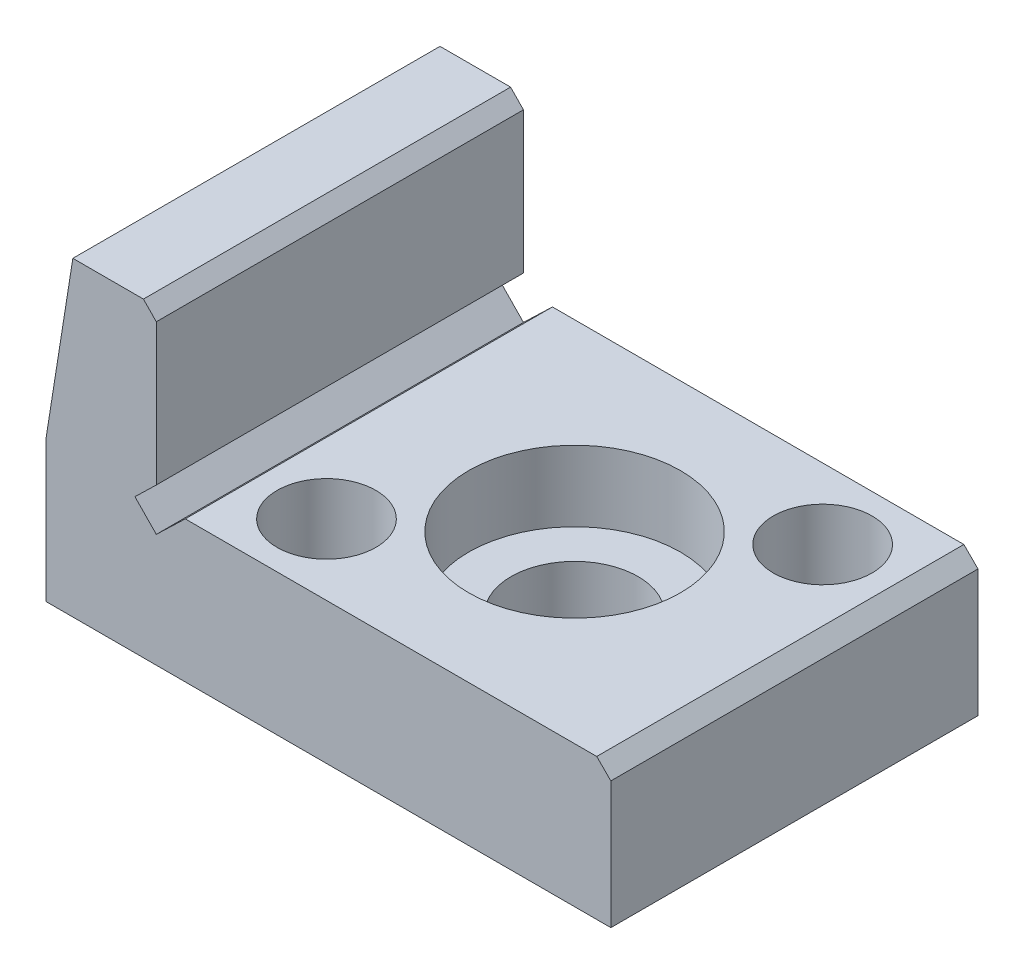
ISO-10303-21;
HEADER;
FILE_DESCRIPTION(('STEP AP214'),'2;1');
FILE_NAME('part.step','',(''),(''),'','','');
FILE_SCHEMA(('AUTOMOTIVE_DESIGN { 1 0 10303 214 1 1 1 1 }'));
ENDSEC;
DATA;
#1=APPLICATION_CONTEXT('core data for automotive mechanical design processes');
#2=APPLICATION_PROTOCOL_DEFINITION('international standard','automotive_design',2000,#1);
#3=PRODUCT_CONTEXT('',#1,'mechanical');
#4=PRODUCT('Part','Part','',(#3));
#5=PRODUCT_RELATED_PRODUCT_CATEGORY('part','',(#4));
#6=PRODUCT_DEFINITION_FORMATION('','',#4);
#7=PRODUCT_DEFINITION_CONTEXT('part definition',#1,'design');
#8=PRODUCT_DEFINITION('design','',#6,#7);
#9=PRODUCT_DEFINITION_SHAPE('','',#8);
#10=(LENGTH_UNIT() NAMED_UNIT(*) SI_UNIT(.MILLI.,.METRE.));
#11=(NAMED_UNIT(*) PLANE_ANGLE_UNIT() SI_UNIT($,.RADIAN.));
#12=(NAMED_UNIT(*) SI_UNIT($,.STERADIAN.) SOLID_ANGLE_UNIT());
#13=UNCERTAINTY_MEASURE_WITH_UNIT(LENGTH_MEASURE(1.E-05),#10,'distance_accuracy_value','');
#14=(GEOMETRIC_REPRESENTATION_CONTEXT(3) GLOBAL_UNCERTAINTY_ASSIGNED_CONTEXT((#13)) GLOBAL_UNIT_ASSIGNED_CONTEXT((#10,
#11,#12)) REPRESENTATION_CONTEXT('',''));
#15=CARTESIAN_POINT('',(0.,0.,0.));
#16=DIRECTION('',(0.,0.,1.));
#17=DIRECTION('',(1.,0.,0.));
#18=AXIS2_PLACEMENT_3D('',#15,#16,#17);
#19=CARTESIAN_POINT('',(24.4314366080419,-16.,13.));
#20=DIRECTION('',(0.,1.,0.));
#21=DIRECTION('',(0.,0.,1.));
#22=AXIS2_PLACEMENT_3D('',#19,#20,#21);
#23=CYLINDRICAL_SURFACE('',#22,4.5);
#24=CARTESIAN_POINT('',(24.4314366080419,0.,13.));
#25=DIRECTION('',(0.,1.,0.));
#26=DIRECTION('',(0.,0.,1.));
#27=AXIS2_PLACEMENT_3D('',#24,#25,#26);
#28=CIRCLE('',#27,4.5);
#29=CARTESIAN_POINT('',(24.4314366080419,0.,17.5));
#30=VERTEX_POINT('',#29);
#31=EDGE_CURVE('E418',#30,#30,#28,.T.);
#32=CARTESIAN_POINT('',(24.4314366080419,5.,13.));
#33=DIRECTION('',(0.,1.,0.));
#34=DIRECTION('',(0.,0.,1.));
#35=AXIS2_PLACEMENT_3D('',#32,#33,#34);
#36=CIRCLE('',#35,4.5);
#37=CARTESIAN_POINT('',(24.4314366080419,5.,17.5));
#38=VERTEX_POINT('',#37);
#39=EDGE_CURVE('E438',#38,#38,#36,.T.);
#40=CARTESIAN_POINT('',(24.4314366080419,0.,17.5));
#41=CARTESIAN_POINT('',(24.4314366080419,0.0520833333333264,17.5));
#42=CARTESIAN_POINT('',(24.4314366080419,0.10416666666666,17.5));
#43=CARTESIAN_POINT('',(24.4314366080419,0.208333333333327,17.5));
#44=CARTESIAN_POINT('',(24.4314366080419,0.26041666666666,17.5));
#45=CARTESIAN_POINT('',(24.4314366080419,0.364583333333327,17.5));
#46=CARTESIAN_POINT('',(24.4314366080419,0.41666666666666,17.5));
#47=CARTESIAN_POINT('',(24.4314366080419,0.520833333333327,17.5));
#48=CARTESIAN_POINT('',(24.4314366080419,0.57291666666666,17.5));
#49=CARTESIAN_POINT('',(24.4314366080419,0.677083333333327,17.5));
#50=CARTESIAN_POINT('',(24.4314366080419,0.72916666666666,17.5));
#51=CARTESIAN_POINT('',(24.4314366080419,0.833333333333327,17.5));
#52=CARTESIAN_POINT('',(24.4314366080419,0.885416666666661,17.5));
#53=CARTESIAN_POINT('',(24.4314366080419,0.989583333333327,17.5));
#54=CARTESIAN_POINT('',(24.4314366080419,1.04166666666666,17.5));
#55=CARTESIAN_POINT('',(24.4314366080419,1.14583333333333,17.5));
#56=CARTESIAN_POINT('',(24.4314366080419,1.19791666666666,17.5));
#57=CARTESIAN_POINT('',(24.4314366080419,1.30208333333333,17.5));
#58=CARTESIAN_POINT('',(24.4314366080419,1.35416666666666,17.5));
#59=CARTESIAN_POINT('',(24.4314366080419,1.45833333333333,17.5));
#60=CARTESIAN_POINT('',(24.4314366080419,1.51041666666666,17.5));
#61=CARTESIAN_POINT('',(24.4314366080419,1.61458333333333,17.5));
#62=CARTESIAN_POINT('',(24.4314366080419,1.66666666666666,17.5));
#63=CARTESIAN_POINT('',(24.4314366080419,1.77083333333333,17.5));
#64=CARTESIAN_POINT('',(24.4314366080419,1.82291666666666,17.5));
#65=CARTESIAN_POINT('',(24.4314366080419,1.92708333333333,17.5));
#66=CARTESIAN_POINT('',(24.4314366080419,1.97916666666667,17.5));
#67=CARTESIAN_POINT('',(24.4314366080419,2.08333333333333,17.5));
#68=CARTESIAN_POINT('',(24.4314366080419,2.13541666666667,17.5));
#69=CARTESIAN_POINT('',(24.4314366080419,2.23958333333333,17.5));
#70=CARTESIAN_POINT('',(24.4314366080419,2.29166666666667,17.5));
#71=CARTESIAN_POINT('',(24.4314366080419,2.39583333333333,17.5));
#72=CARTESIAN_POINT('',(24.4314366080419,2.44791666666667,17.5));
#73=CARTESIAN_POINT('',(24.4314366080419,2.55208333333333,17.5));
#74=CARTESIAN_POINT('',(24.4314366080419,2.60416666666667,17.5));
#75=CARTESIAN_POINT('',(24.4314366080419,2.70833333333333,17.5));
#76=CARTESIAN_POINT('',(24.4314366080419,2.76041666666667,17.5));
#77=CARTESIAN_POINT('',(24.4314366080419,2.86458333333333,17.5));
#78=CARTESIAN_POINT('',(24.4314366080419,2.91666666666667,17.5));
#79=CARTESIAN_POINT('',(24.4314366080419,3.02083333333333,17.5));
#80=CARTESIAN_POINT('',(24.4314366080419,3.07291666666667,17.5));
#81=CARTESIAN_POINT('',(24.4314366080419,3.17708333333333,17.5));
#82=CARTESIAN_POINT('',(24.4314366080419,3.22916666666667,17.5));
#83=CARTESIAN_POINT('',(24.4314366080419,3.33333333333333,17.5));
#84=CARTESIAN_POINT('',(24.4314366080419,3.38541666666667,17.5));
#85=CARTESIAN_POINT('',(24.4314366080419,3.48958333333333,17.5));
#86=CARTESIAN_POINT('',(24.4314366080419,3.54166666666667,17.5));
#87=CARTESIAN_POINT('',(24.4314366080419,3.64583333333333,17.5));
#88=CARTESIAN_POINT('',(24.4314366080419,3.69791666666667,17.5));
#89=CARTESIAN_POINT('',(24.4314366080419,3.80208333333334,17.5));
#90=CARTESIAN_POINT('',(24.4314366080419,3.85416666666667,17.5));
#91=CARTESIAN_POINT('',(24.4314366080419,3.95833333333333,17.5));
#92=CARTESIAN_POINT('',(24.4314366080419,4.01041666666667,17.5));
#93=CARTESIAN_POINT('',(24.4314366080419,4.11458333333334,17.5));
#94=CARTESIAN_POINT('',(24.4314366080419,4.16666666666667,17.5));
#95=CARTESIAN_POINT('',(24.4314366080419,4.27083333333334,17.5));
#96=CARTESIAN_POINT('',(24.4314366080419,4.32291666666667,17.5));
#97=CARTESIAN_POINT('',(24.4314366080419,4.42708333333334,17.5));
#98=CARTESIAN_POINT('',(24.4314366080419,4.47916666666667,17.5));
#99=CARTESIAN_POINT('',(24.4314366080419,4.58333333333334,17.5));
#100=CARTESIAN_POINT('',(24.4314366080419,4.63541666666667,17.5));
#101=CARTESIAN_POINT('',(24.4314366080419,4.73958333333334,17.5));
#102=CARTESIAN_POINT('',(24.4314366080419,4.79166666666667,17.5));
#103=CARTESIAN_POINT('',(24.4314366080419,4.89583333333334,17.5));
#104=CARTESIAN_POINT('',(24.4314366080419,4.94791666666667,17.5));
#105=CARTESIAN_POINT('',(24.4314366080419,5.,17.5));
#106=B_SPLINE_CURVE_WITH_KNOTS('',3,(#40,#41,#42,#43,#44,#45,#46,#47,#48,#49,#50,#51,#52,#53,
#54,#55,#56,#57,#58,#59,#60,#61,#62,#63,#64,#65,#66,#67,#68,#69,#70,#71,#72,#73,#74,#75,#76,#77,
#78,#79,#80,#81,#82,#83,#84,#85,#86,#87,#88,#89,#90,#91,#92,#93,#94,#95,#96,#97,#98,#99,#100,
#101,#102,#103,#104,#105),.UNSPECIFIED.,.F.,.F.,(4,2,2,2,2,2,2,2,2,2,2,2,2,2,2,2,2,2,2,2,2,2,2,
2,2,2,2,2,2,2,2,2,4),(0.,0.15625,0.3125,0.46875,0.625000000000001,0.781250000000001,
0.937500000000001,1.09375,1.25,1.40625,1.5625,1.71875,1.87500000000001,2.03125000000001,
2.18750000000001,2.34375000000001,2.50000000000001,2.65625000000001,2.81250000000001,
2.96875000000001,3.12500000000001,3.28125000000001,3.43750000000001,3.59375000000001,
3.75000000000001,3.90625000000001,4.06250000000001,4.21875000000001,4.37500000000001,
4.53125000000001,4.68750000000001,4.84375000000001,5.00000000000001),.UNSPECIFIED.);
#107=EDGE_CURVE('BSEAM32',#30,#38,#106,.T.);
#108=ORIENTED_EDGE('',*,*,#31,.F.);
#109=ORIENTED_EDGE('',*,*,#39,.T.);
#110=ORIENTED_EDGE('',*,*,#107,.T.);
#111=ORIENTED_EDGE('',*,*,#107,.F.);
#112=EDGE_LOOP('',(#108,#110,#109,#111));
#113=FACE_BOUND('',#112,.T.);
#114=ADVANCED_FACE('F32',(#113),#23,.F.);
#115=CARTESIAN_POINT('',(0.,10.,26.));
#116=DIRECTION('',(1.,0.,0.));
#117=DIRECTION('',(0.,1.,0.));
#118=AXIS2_PLACEMENT_3D('',#115,#116,#117);
#119=PLANE('',#118);
#120=DIRECTION('',(0.,-1.,0.));
#121=VECTOR('',#120,1.);
#122=CARTESIAN_POINT('',(0.,10.,0.));
#123=LINE('',#122,#121);
#124=CARTESIAN_POINT('',(0.,10.,0.));
#125=VERTEX_POINT('',#124);
#126=CARTESIAN_POINT('',(0.,0.,0.));
#127=VERTEX_POINT('',#126);
#128=EDGE_CURVE('E153',#125,#127,#123,.T.);
#129=ORIENTED_EDGE('',*,*,#128,.T.);
#130=DIRECTION('',(0.,0.,-1.));
#131=VECTOR('',#130,1.);
#132=CARTESIAN_POINT('',(0.,0.,26.));
#133=LINE('',#132,#131);
#134=CARTESIAN_POINT('',(0.,0.,26.));
#135=VERTEX_POINT('',#134);
#136=EDGE_CURVE('E11',#135,#127,#133,.T.);
#137=ORIENTED_EDGE('',*,*,#136,.F.);
#138=DIRECTION('',(0.,-1.,0.));
#139=VECTOR('',#138,1.);
#140=CARTESIAN_POINT('',(0.,10.,26.));
#141=LINE('',#140,#139);
#142=CARTESIAN_POINT('',(0.,10.,26.));
#143=VERTEX_POINT('',#142);
#144=EDGE_CURVE('E176',#143,#135,#141,.T.);
#145=ORIENTED_EDGE('',*,*,#144,.F.);
#146=DIRECTION('',(0.,0.,-1.));
#147=VECTOR('',#146,1.);
#148=CARTESIAN_POINT('',(0.,10.,26.));
#149=LINE('',#148,#147);
#150=EDGE_CURVE('E149',#143,#125,#149,.T.);
#151=ORIENTED_EDGE('',*,*,#150,.T.);
#152=EDGE_LOOP('',(#129,#137,#145,#151));
#153=FACE_BOUND('',#152,.T.);
#154=ADVANCED_FACE('F34',(#153),#119,.F.);
#155=CARTESIAN_POINT('',(0.,0.,26.));
#156=DIRECTION('',(0.,1.,0.));
#157=DIRECTION('',(0.,0.,1.));
#158=AXIS2_PLACEMENT_3D('',#155,#156,#157);
#159=PLANE('',#158);
#160=CARTESIAN_POINT('',(34.,0.,5.));
#161=DIRECTION('',(0.,1.,0.));
#162=DIRECTION('',(0.,0.,1.));
#163=AXIS2_PLACEMENT_3D('',#160,#161,#162);
#164=CIRCLE('',#163,3.5);
#165=CARTESIAN_POINT('',(34.,0.,8.5));
#166=VERTEX_POINT('',#165);
#167=EDGE_CURVE('E415',#166,#166,#164,.T.);
#168=ORIENTED_EDGE('',*,*,#167,.T.);
#169=EDGE_LOOP('',(#168));
#170=FACE_BOUND('',#169,.T.);
#171=ORIENTED_EDGE('',*,*,#31,.T.);
#172=EDGE_LOOP('',(#171));
#173=FACE_BOUND('',#172,.T.);
#174=CARTESIAN_POINT('',(14.8628732160838,0.,21.));
#175=DIRECTION('',(0.,1.,0.));
#176=DIRECTION('',(0.,0.,1.));
#177=AXIS2_PLACEMENT_3D('',#174,#175,#176);
#178=CIRCLE('',#177,3.5);
#179=CARTESIAN_POINT('',(14.8628732160838,0.,24.5));
#180=VERTEX_POINT('',#179);
#181=EDGE_CURVE('E157',#180,#180,#178,.T.);
#182=ORIENTED_EDGE('',*,*,#181,.T.);
#183=EDGE_LOOP('',(#182));
#184=FACE_BOUND('',#183,.T.);
#185=DIRECTION('',(1.,0.,0.));
#186=VECTOR('',#185,1.);
#187=CARTESIAN_POINT('',(0.,0.,0.));
#188=LINE('',#187,#186);
#189=CARTESIAN_POINT('',(40.,0.,0.));
#190=VERTEX_POINT('',#189);
#191=EDGE_CURVE('E156',#127,#190,#188,.T.);
#192=ORIENTED_EDGE('',*,*,#191,.T.);
#193=DIRECTION('',(0.,0.,-1.));
#194=VECTOR('',#193,1.);
#195=CARTESIAN_POINT('',(40.,0.,26.));
#196=LINE('',#195,#194);
#197=CARTESIAN_POINT('',(40.,0.,26.));
#198=VERTEX_POINT('',#197);
#199=EDGE_CURVE('E41',#198,#190,#196,.T.);
#200=ORIENTED_EDGE('',*,*,#199,.F.);
#201=DIRECTION('',(1.,0.,0.));
#202=VECTOR('',#201,1.);
#203=CARTESIAN_POINT('',(0.,0.,26.));
#204=LINE('',#203,#202);
#205=EDGE_CURVE('E104',#135,#198,#204,.T.);
#206=ORIENTED_EDGE('',*,*,#205,.F.);
#207=ORIENTED_EDGE('',*,*,#136,.T.);
#208=EDGE_LOOP('',(#192,#200,#206,#207));
#209=FACE_BOUND('',#208,.T.);
#210=ADVANCED_FACE('F259',(#170,#173,#184,#209),#159,.F.);
#211=CARTESIAN_POINT('',(40.,0.,26.));
#212=DIRECTION('',(-1.,0.,0.));
#213=DIRECTION('',(0.,0.,1.));
#214=AXIS2_PLACEMENT_3D('',#211,#212,#213);
#215=PLANE('',#214);
#216=DIRECTION('',(0.,1.,0.));
#217=VECTOR('',#216,1.);
#218=CARTESIAN_POINT('',(40.,0.,0.));
#219=LINE('',#218,#217);
#220=CARTESIAN_POINT('',(40.,9.,0.));
#221=VERTEX_POINT('',#220);
#222=EDGE_CURVE('E159',#190,#221,#219,.T.);
#223=ORIENTED_EDGE('',*,*,#222,.T.);
#224=DIRECTION('',(0.,0.,-1.));
#225=VECTOR('',#224,1.);
#226=CARTESIAN_POINT('',(40.,9.,26.));
#227=LINE('',#226,#225);
#228=CARTESIAN_POINT('',(40.,9.,26.));
#229=VERTEX_POINT('',#228);
#230=EDGE_CURVE('E195',#229,#221,#227,.T.);
#231=ORIENTED_EDGE('',*,*,#230,.F.);
#232=DIRECTION('',(0.,1.,0.));
#233=VECTOR('',#232,1.);
#234=CARTESIAN_POINT('',(40.,0.,26.));
#235=LINE('',#234,#233);
#236=EDGE_CURVE('E203',#198,#229,#235,.T.);
#237=ORIENTED_EDGE('',*,*,#236,.F.);
#238=ORIENTED_EDGE('',*,*,#199,.T.);
#239=EDGE_LOOP('',(#223,#231,#237,#238));
#240=FACE_BOUND('',#239,.T.);
#241=ADVANCED_FACE('F201',(#240),#215,.F.);
#242=CARTESIAN_POINT('',(40.,9.,26.));
#243=DIRECTION('',(-0.707106781186548,-0.707106781186548,0.));
#244=DIRECTION('',(0.707106781186548,-0.707106781186548,0.));
#245=AXIS2_PLACEMENT_3D('',#242,#243,#244);
#246=PLANE('',#245);
#247=DIRECTION('',(-0.707106781186547,0.707106781186547,0.));
#248=VECTOR('',#247,1.);
#249=CARTESIAN_POINT('',(40.,9.,0.));
#250=LINE('',#249,#248);
#251=CARTESIAN_POINT('',(39.,10.,0.));
#252=VERTEX_POINT('',#251);
#253=EDGE_CURVE('E161',#221,#252,#250,.T.);
#254=ORIENTED_EDGE('',*,*,#253,.T.);
#255=DIRECTION('',(0.,0.,-1.));
#256=VECTOR('',#255,1.);
#257=CARTESIAN_POINT('',(39.,10.,26.));
#258=LINE('',#257,#256);
#259=CARTESIAN_POINT('',(39.,10.,26.));
#260=VERTEX_POINT('',#259);
#261=EDGE_CURVE('E192',#260,#252,#258,.T.);
#262=ORIENTED_EDGE('',*,*,#261,.F.);
#263=DIRECTION('',(-0.707106781186547,0.707106781186547,0.));
#264=VECTOR('',#263,1.);
#265=CARTESIAN_POINT('',(40.,9.,26.));
#266=LINE('',#265,#264);
#267=EDGE_CURVE('E221',#229,#260,#266,.T.);
#268=ORIENTED_EDGE('',*,*,#267,.F.);
#269=ORIENTED_EDGE('',*,*,#230,.T.);
#270=EDGE_LOOP('',(#254,#262,#268,#269));
#271=FACE_BOUND('',#270,.T.);
#272=ADVANCED_FACE('F212',(#271),#246,.F.);
#273=CARTESIAN_POINT('',(39.,10.,26.));
#274=DIRECTION('',(0.,-1.,0.));
#275=DIRECTION('',(0.,0.,-1.));
#276=AXIS2_PLACEMENT_3D('',#273,#274,#275);
#277=PLANE('',#276);
#278=CARTESIAN_POINT('',(24.4314366080419,10.,13.));
#279=DIRECTION('',(0.,1.,0.));
#280=DIRECTION('',(0.,0.,1.));
#281=AXIS2_PLACEMENT_3D('',#278,#279,#280);
#282=CIRCLE('',#281,7.5);
#283=CARTESIAN_POINT('',(24.4314366080419,10.,20.5));
#284=VERTEX_POINT('',#283);
#285=EDGE_CURVE('E435',#284,#284,#282,.T.);
#286=ORIENTED_EDGE('',*,*,#285,.F.);
#287=EDGE_LOOP('',(#286));
#288=FACE_BOUND('',#287,.T.);
#289=CARTESIAN_POINT('',(34.,10.,5.));
#290=DIRECTION('',(0.,1.,0.));
#291=DIRECTION('',(0.,0.,1.));
#292=AXIS2_PLACEMENT_3D('',#289,#290,#291);
#293=CIRCLE('',#292,3.5);
#294=CARTESIAN_POINT('',(34.,10.,8.5));
#295=VERTEX_POINT('',#294);
#296=EDGE_CURVE('E431',#295,#295,#293,.T.);
#297=ORIENTED_EDGE('',*,*,#296,.F.);
#298=EDGE_LOOP('',(#297));
#299=FACE_BOUND('',#298,.T.);
#300=CARTESIAN_POINT('',(14.8628732160838,10.,21.));
#301=DIRECTION('',(0.,1.,0.));
#302=DIRECTION('',(0.,0.,1.));
#303=AXIS2_PLACEMENT_3D('',#300,#301,#302);
#304=CIRCLE('',#303,3.5);
#305=CARTESIAN_POINT('',(14.8628732160838,10.,24.5));
#306=VERTEX_POINT('',#305);
#307=EDGE_CURVE('E422',#306,#306,#304,.T.);
#308=ORIENTED_EDGE('',*,*,#307,.F.);
#309=EDGE_LOOP('',(#308));
#310=FACE_BOUND('',#309,.T.);
#311=DIRECTION('',(-1.,0.,0.));
#312=VECTOR('',#311,1.);
#313=CARTESIAN_POINT('',(39.,10.,0.));
#314=LINE('',#313,#312);
#315=CARTESIAN_POINT('',(9.86287321608383,10.,0.));
#316=VERTEX_POINT('',#315);
#317=EDGE_CURVE('E163',#252,#316,#314,.T.);
#318=ORIENTED_EDGE('',*,*,#317,.T.);
#319=DIRECTION('',(0.,0.,-1.));
#320=VECTOR('',#319,1.);
#321=CARTESIAN_POINT('',(9.86287321608383,10.,26.));
#322=LINE('',#321,#320);
#323=CARTESIAN_POINT('',(9.86287321608383,10.,26.));
#324=VERTEX_POINT('',#323);
#325=EDGE_CURVE('E189',#324,#316,#322,.T.);
#326=ORIENTED_EDGE('',*,*,#325,.F.);
#327=DIRECTION('',(-1.,0.,0.));
#328=VECTOR('',#327,1.);
#329=CARTESIAN_POINT('',(39.,10.,26.));
#330=LINE('',#329,#328);
#331=EDGE_CURVE('E218',#260,#324,#330,.T.);
#332=ORIENTED_EDGE('',*,*,#331,.F.);
#333=ORIENTED_EDGE('',*,*,#261,.T.);
#334=EDGE_LOOP('',(#318,#326,#332,#333));
#335=FACE_BOUND('',#334,.T.);
#336=ADVANCED_FACE('F216',(#288,#299,#310,#335),#277,.F.);
#337=CARTESIAN_POINT('',(7.81128605187017,8.02514603183012,26.));
#338=DIRECTION('',(0.693505294902463,-0.720451529210847,0.));
#339=DIRECTION('',(0.720451529210847,0.693505294902463,0.));
#340=AXIS2_PLACEMENT_3D('',#337,#338,#339);
#341=PLANE('',#340);
#342=DIRECTION('',(-0.720451529210847,-0.693505294902463,0.));
#343=VECTOR('',#342,1.);
#344=CARTESIAN_POINT('',(7.81128605187017,8.02514603183012,0.));
#345=LINE('',#344,#343);
#346=CARTESIAN_POINT('',(7.81128605187017,8.02514603183012,0.));
#347=VERTEX_POINT('',#346);
#348=EDGE_CURVE('E165',#316,#347,#345,.T.);
#349=ORIENTED_EDGE('',*,*,#348,.T.);
#350=DIRECTION('',(0.,0.,-1.));
#351=VECTOR('',#350,1.);
#352=CARTESIAN_POINT('',(7.81128605187017,8.02514603183012,26.));
#353=LINE('',#352,#351);
#354=CARTESIAN_POINT('',(7.81128605187017,8.02514603183012,26.));
#355=VERTEX_POINT('',#354);
#356=EDGE_CURVE('E186',#355,#347,#353,.T.);
#357=ORIENTED_EDGE('',*,*,#356,.F.);
#358=DIRECTION('',(-0.720451529210847,-0.693505294902463,0.));
#359=VECTOR('',#358,1.);
#360=CARTESIAN_POINT('',(7.81128605187017,8.02514603183012,26.));
#361=LINE('',#360,#359);
#362=EDGE_CURVE('E220',#324,#355,#361,.T.);
#363=ORIENTED_EDGE('',*,*,#362,.F.);
#364=ORIENTED_EDGE('',*,*,#325,.T.);
#365=EDGE_LOOP('',(#349,#357,#363,#364));
#366=FACE_BOUND('',#365,.T.);
#367=ADVANCED_FACE('F358',(#366),#341,.F.);
#368=CARTESIAN_POINT('',(6.29823885044334,9.58053694397296,26.));
#369=DIRECTION('',(-0.716796437594259,-0.697282487269098,0.));
#370=DIRECTION('',(0.697282487269098,-0.716796437594259,0.));
#371=AXIS2_PLACEMENT_3D('',#368,#369,#370);
#372=PLANE('',#371);
#373=DIRECTION('',(-0.697282487269098,0.716796437594259,0.));
#374=VECTOR('',#373,1.);
#375=CARTESIAN_POINT('',(6.29823885044334,9.58053694397296,0.));
#376=LINE('',#375,#374);
#377=CARTESIAN_POINT('',(6.29823885044334,9.58053694397296,0.));
#378=VERTEX_POINT('',#377);
#379=EDGE_CURVE('E167',#347,#378,#376,.T.);
#380=ORIENTED_EDGE('',*,*,#379,.T.);
#381=DIRECTION('',(0.,0.,-1.));
#382=VECTOR('',#381,1.);
#383=CARTESIAN_POINT('',(6.29823885044334,9.58053694397296,26.));
#384=LINE('',#383,#382);
#385=CARTESIAN_POINT('',(6.29823885044334,9.58053694397296,26.));
#386=VERTEX_POINT('',#385);
#387=EDGE_CURVE('E183',#386,#378,#384,.T.);
#388=ORIENTED_EDGE('',*,*,#387,.F.);
#389=DIRECTION('',(-0.697282487269098,0.716796437594259,0.));
#390=VECTOR('',#389,1.);
#391=CARTESIAN_POINT('',(6.29823885044334,9.58053694397296,26.));
#392=LINE('',#391,#390);
#393=EDGE_CURVE('E223',#355,#386,#392,.T.);
#394=ORIENTED_EDGE('',*,*,#393,.F.);
#395=ORIENTED_EDGE('',*,*,#356,.T.);
#396=EDGE_LOOP('',(#380,#388,#394,#395));
#397=FACE_BOUND('',#396,.T.);
#398=ADVANCED_FACE('F350',(#397),#372,.F.);
#399=CARTESIAN_POINT('',(7.81128605187017,11.0523931930182,26.));
#400=DIRECTION('',(-0.697282487269098,0.716796437594259,0.));
#401=DIRECTION('',(-0.716796437594259,-0.697282487269098,0.));
#402=AXIS2_PLACEMENT_3D('',#399,#400,#401);
#403=PLANE('',#402);
#404=DIRECTION('',(0.716796437594259,0.697282487269098,0.));
#405=VECTOR('',#404,1.);
#406=CARTESIAN_POINT('',(7.81128605187017,11.0523931930182,0.));
#407=LINE('',#406,#405);
#408=CARTESIAN_POINT('',(7.81128605187017,11.0523931930182,0.));
#409=VERTEX_POINT('',#408);
#410=EDGE_CURVE('E169',#378,#409,#407,.T.);
#411=ORIENTED_EDGE('',*,*,#410,.T.);
#412=DIRECTION('',(0.,0.,-1.));
#413=VECTOR('',#412,1.);
#414=CARTESIAN_POINT('',(7.81128605187017,11.0523931930182,26.));
#415=LINE('',#414,#413);
#416=CARTESIAN_POINT('',(7.81128605187017,11.0523931930182,26.));
#417=VERTEX_POINT('',#416);
#418=EDGE_CURVE('E180',#417,#409,#415,.T.);
#419=ORIENTED_EDGE('',*,*,#418,.F.);
#420=DIRECTION('',(0.716796437594259,0.697282487269098,0.));
#421=VECTOR('',#420,1.);
#422=CARTESIAN_POINT('',(7.81128605187017,11.0523931930182,26.));
#423=LINE('',#422,#421);
#424=EDGE_CURVE('E229',#386,#417,#423,.T.);
#425=ORIENTED_EDGE('',*,*,#424,.F.);
#426=ORIENTED_EDGE('',*,*,#387,.T.);
#427=EDGE_LOOP('',(#411,#419,#425,#426));
#428=FACE_BOUND('',#427,.T.);
#429=ADVANCED_FACE('F235',(#428),#403,.F.);
#430=CARTESIAN_POINT('',(7.81128605187017,21.0638414017027,26.));
#431=DIRECTION('',(-1.,0.,0.));
#432=DIRECTION('',(0.,0.,1.));
#433=AXIS2_PLACEMENT_3D('',#430,#431,#432);
#434=PLANE('',#433);
#435=DIRECTION('',(0.,1.,0.));
#436=VECTOR('',#435,1.);
#437=CARTESIAN_POINT('',(7.81128605187017,21.0638414017027,0.));
#438=LINE('',#437,#436);
#439=CARTESIAN_POINT('',(7.81128605187017,21.0638414017027,0.));
#440=VERTEX_POINT('',#439);
#441=EDGE_CURVE('E171',#409,#440,#438,.T.);
#442=ORIENTED_EDGE('',*,*,#441,.T.);
#443=DIRECTION('',(0.,0.,-1.));
#444=VECTOR('',#443,1.);
#445=CARTESIAN_POINT('',(7.81128605187017,21.0638414017027,26.));
#446=LINE('',#445,#444);
#447=CARTESIAN_POINT('',(7.81128605187017,21.0638414017027,26.));
#448=VERTEX_POINT('',#447);
#449=EDGE_CURVE('E144',#448,#440,#446,.T.);
#450=ORIENTED_EDGE('',*,*,#449,.F.);
#451=DIRECTION('',(0.,1.,0.));
#452=VECTOR('',#451,1.);
#453=CARTESIAN_POINT('',(7.81128605187017,21.0638414017027,26.));
#454=LINE('',#453,#452);
#455=EDGE_CURVE('E135',#417,#448,#454,.T.);
#456=ORIENTED_EDGE('',*,*,#455,.F.);
#457=ORIENTED_EDGE('',*,*,#418,.T.);
#458=EDGE_LOOP('',(#442,#450,#456,#457));
#459=FACE_BOUND('',#458,.T.);
#460=ADVANCED_FACE('F239',(#459),#434,.F.);
#461=CARTESIAN_POINT('',(6.90061328389444,22.,26.));
#462=DIRECTION('',(-0.716796437594259,-0.697282487269098,0.));
#463=DIRECTION('',(0.697282487269098,-0.716796437594259,0.));
#464=AXIS2_PLACEMENT_3D('',#461,#462,#463);
#465=PLANE('',#464);
#466=DIRECTION('',(-0.697282487269098,0.716796437594259,0.));
#467=VECTOR('',#466,1.);
#468=CARTESIAN_POINT('',(6.90061328389444,22.,0.));
#469=LINE('',#468,#467);
#470=CARTESIAN_POINT('',(6.90061328389444,22.,0.));
#471=VERTEX_POINT('',#470);
#472=EDGE_CURVE('E143',#440,#471,#469,.T.);
#473=ORIENTED_EDGE('',*,*,#472,.T.);
#474=DIRECTION('',(0.,0.,-1.));
#475=VECTOR('',#474,1.);
#476=CARTESIAN_POINT('',(6.90061328389444,22.,26.));
#477=LINE('',#476,#475);
#478=CARTESIAN_POINT('',(6.90061328389444,22.,26.));
#479=VERTEX_POINT('',#478);
#480=EDGE_CURVE('E140',#479,#471,#477,.T.);
#481=ORIENTED_EDGE('',*,*,#480,.F.);
#482=DIRECTION('',(-0.697282487269098,0.716796437594259,0.));
#483=VECTOR('',#482,1.);
#484=CARTESIAN_POINT('',(6.90061328389444,22.,26.));
#485=LINE('',#484,#483);
#486=EDGE_CURVE('E129',#448,#479,#485,.T.);
#487=ORIENTED_EDGE('',*,*,#486,.F.);
#488=ORIENTED_EDGE('',*,*,#449,.T.);
#489=EDGE_LOOP('',(#473,#481,#487,#488));
#490=FACE_BOUND('',#489,.T.);
#491=ADVANCED_FACE('F141',(#490),#465,.F.);
#492=CARTESIAN_POINT('',(6.90061328389444,22.,26.));
#493=DIRECTION('',(0.,-1.,0.));
#494=DIRECTION('',(0.,0.,-1.));
#495=AXIS2_PLACEMENT_3D('',#492,#493,#494);
#496=PLANE('',#495);
#497=DIRECTION('',(-1.,0.,0.));
#498=VECTOR('',#497,1.);
#499=CARTESIAN_POINT('',(6.90061328389444,22.,0.));
#500=LINE('',#499,#498);
#501=CARTESIAN_POINT('',(1.90061328389444,22.,0.));
#502=VERTEX_POINT('',#501);
#503=EDGE_CURVE('E90',#471,#502,#500,.T.);
#504=ORIENTED_EDGE('',*,*,#503,.T.);
#505=DIRECTION('',(0.,0.,-1.));
#506=VECTOR('',#505,1.);
#507=CARTESIAN_POINT('',(1.90061328389444,22.,26.));
#508=LINE('',#507,#506);
#509=CARTESIAN_POINT('',(1.90061328389444,22.,26.));
#510=VERTEX_POINT('',#509);
#511=EDGE_CURVE('E145',#510,#502,#508,.T.);
#512=ORIENTED_EDGE('',*,*,#511,.F.);
#513=DIRECTION('',(-1.,0.,0.));
#514=VECTOR('',#513,1.);
#515=CARTESIAN_POINT('',(6.90061328389444,22.,26.));
#516=LINE('',#515,#514);
#517=EDGE_CURVE('E133',#479,#510,#516,.T.);
#518=ORIENTED_EDGE('',*,*,#517,.F.);
#519=ORIENTED_EDGE('',*,*,#480,.T.);
#520=EDGE_LOOP('',(#504,#512,#518,#519));
#521=FACE_BOUND('',#520,.T.);
#522=ADVANCED_FACE('F147',(#521),#496,.F.);
#523=CARTESIAN_POINT('',(1.90061328389444,22.,26.));
#524=DIRECTION('',(0.987688340595138,-0.156434465040231,0.));
#525=DIRECTION('',(0.156434465040231,0.987688340595138,0.));
#526=AXIS2_PLACEMENT_3D('',#523,#524,#525);
#527=PLANE('',#526);
#528=DIRECTION('',(-0.156434465040231,-0.987688340595138,0.));
#529=VECTOR('',#528,1.);
#530=CARTESIAN_POINT('',(1.90061328389444,22.,0.));
#531=LINE('',#530,#529);
#532=EDGE_CURVE('E96',#502,#125,#531,.T.);
#533=ORIENTED_EDGE('',*,*,#532,.T.);
#534=ORIENTED_EDGE('',*,*,#150,.F.);
#535=DIRECTION('',(-0.156434465040231,-0.987688340595138,0.));
#536=VECTOR('',#535,1.);
#537=CARTESIAN_POINT('',(1.90061328389444,22.,26.));
#538=LINE('',#537,#536);
#539=EDGE_CURVE('E49',#510,#143,#538,.T.);
#540=ORIENTED_EDGE('',*,*,#539,.F.);
#541=ORIENTED_EDGE('',*,*,#511,.T.);
#542=EDGE_LOOP('',(#533,#534,#540,#541));
#543=FACE_BOUND('',#542,.T.);
#544=ADVANCED_FACE('F243',(#543),#527,.F.);
#545=CARTESIAN_POINT('',(0.,0.,26.));
#546=DIRECTION('',(0.,0.,1.));
#547=DIRECTION('',(1.,0.,0.));
#548=AXIS2_PLACEMENT_3D('',#545,#546,#547);
#549=PLANE('',#548);
#550=ORIENTED_EDGE('',*,*,#144,.T.);
#551=ORIENTED_EDGE('',*,*,#205,.T.);
#552=ORIENTED_EDGE('',*,*,#236,.T.);
#553=ORIENTED_EDGE('',*,*,#267,.T.);
#554=ORIENTED_EDGE('',*,*,#331,.T.);
#555=ORIENTED_EDGE('',*,*,#362,.T.);
#556=ORIENTED_EDGE('',*,*,#393,.T.);
#557=ORIENTED_EDGE('',*,*,#424,.T.);
#558=ORIENTED_EDGE('',*,*,#455,.T.);
#559=ORIENTED_EDGE('',*,*,#486,.T.);
#560=ORIENTED_EDGE('',*,*,#517,.T.);
#561=ORIENTED_EDGE('',*,*,#539,.T.);
#562=EDGE_LOOP('',(#550,#551,#552,#553,#554,#555,#556,#557,#558,#559,#560,#561));
#563=FACE_BOUND('',#562,.T.);
#564=ADVANCED_FACE('F131',(#563),#549,.T.);
#565=CARTESIAN_POINT('',(0.,0.,0.));
#566=DIRECTION('',(0.,0.,1.));
#567=DIRECTION('',(1.,0.,0.));
#568=AXIS2_PLACEMENT_3D('',#565,#566,#567);
#569=PLANE('',#568);
#570=ORIENTED_EDGE('',*,*,#128,.F.);
#571=ORIENTED_EDGE('',*,*,#532,.F.);
#572=ORIENTED_EDGE('',*,*,#503,.F.);
#573=ORIENTED_EDGE('',*,*,#472,.F.);
#574=ORIENTED_EDGE('',*,*,#441,.F.);
#575=ORIENTED_EDGE('',*,*,#410,.F.);
#576=ORIENTED_EDGE('',*,*,#379,.F.);
#577=ORIENTED_EDGE('',*,*,#348,.F.);
#578=ORIENTED_EDGE('',*,*,#317,.F.);
#579=ORIENTED_EDGE('',*,*,#253,.F.);
#580=ORIENTED_EDGE('',*,*,#222,.F.);
#581=ORIENTED_EDGE('',*,*,#191,.F.);
#582=EDGE_LOOP('',(#570,#571,#572,#573,#574,#575,#576,#577,#578,#579,#580,#581));
#583=FACE_BOUND('',#582,.T.);
#584=ADVANCED_FACE('F207',(#583),#569,.F.);
#585=CARTESIAN_POINT('',(14.8628732160838,-16.,21.));
#586=DIRECTION('',(0.,1.,0.));
#587=DIRECTION('',(0.,0.,1.));
#588=AXIS2_PLACEMENT_3D('',#585,#586,#587);
#589=CYLINDRICAL_SURFACE('',#588,3.5);
#590=CARTESIAN_POINT('',(14.8628732160838,10.,24.5));
#591=CARTESIAN_POINT('',(14.8628732160838,9.89583333333333,24.5));
#592=CARTESIAN_POINT('',(14.8628732160838,9.79166666666667,24.5));
#593=CARTESIAN_POINT('',(14.8628732160838,9.58333333333333,24.5));
#594=CARTESIAN_POINT('',(14.8628732160838,9.47916666666667,24.5));
#595=CARTESIAN_POINT('',(14.8628732160838,9.27083333333333,24.5));
#596=CARTESIAN_POINT('',(14.8628732160838,9.16666666666667,24.5));
#597=CARTESIAN_POINT('',(14.8628732160838,8.95833333333333,24.5));
#598=CARTESIAN_POINT('',(14.8628732160838,8.85416666666667,24.5));
#599=CARTESIAN_POINT('',(14.8628732160838,8.64583333333333,24.5));
#600=CARTESIAN_POINT('',(14.8628732160838,8.54166666666667,24.5));
#601=CARTESIAN_POINT('',(14.8628732160838,8.33333333333333,24.5));
#602=CARTESIAN_POINT('',(14.8628732160838,8.22916666666667,24.5));
#603=CARTESIAN_POINT('',(14.8628732160838,8.02083333333333,24.5));
#604=CARTESIAN_POINT('',(14.8628732160838,7.91666666666667,24.5));
#605=CARTESIAN_POINT('',(14.8628732160838,7.70833333333333,24.5));
#606=CARTESIAN_POINT('',(14.8628732160838,7.60416666666667,24.5));
#607=CARTESIAN_POINT('',(14.8628732160838,7.39583333333333,24.5));
#608=CARTESIAN_POINT('',(14.8628732160838,7.29166666666667,24.5));
#609=CARTESIAN_POINT('',(14.8628732160838,7.08333333333333,24.5));
#610=CARTESIAN_POINT('',(14.8628732160838,6.97916666666667,24.5));
#611=CARTESIAN_POINT('',(14.8628732160838,6.77083333333333,24.5));
#612=CARTESIAN_POINT('',(14.8628732160838,6.66666666666667,24.5));
#613=CARTESIAN_POINT('',(14.8628732160838,6.45833333333333,24.5));
#614=CARTESIAN_POINT('',(14.8628732160838,6.35416666666667,24.5));
#615=CARTESIAN_POINT('',(14.8628732160838,6.14583333333333,24.5));
#616=CARTESIAN_POINT('',(14.8628732160838,6.04166666666667,24.5));
#617=CARTESIAN_POINT('',(14.8628732160838,5.83333333333333,24.5));
#618=CARTESIAN_POINT('',(14.8628732160838,5.72916666666666,24.5));
#619=CARTESIAN_POINT('',(14.8628732160838,5.52083333333333,24.5));
#620=CARTESIAN_POINT('',(14.8628732160838,5.41666666666666,24.5));
#621=CARTESIAN_POINT('',(14.8628732160838,5.20833333333333,24.5));
#622=CARTESIAN_POINT('',(14.8628732160838,5.10416666666666,24.5));
#623=CARTESIAN_POINT('',(14.8628732160838,4.89583333333333,24.5));
#624=CARTESIAN_POINT('',(14.8628732160838,4.79166666666666,24.5));
#625=CARTESIAN_POINT('',(14.8628732160838,4.58333333333333,24.5));
#626=CARTESIAN_POINT('',(14.8628732160838,4.47916666666666,24.5));
#627=CARTESIAN_POINT('',(14.8628732160838,4.27083333333333,24.5));
#628=CARTESIAN_POINT('',(14.8628732160838,4.16666666666666,24.5));
#629=CARTESIAN_POINT('',(14.8628732160838,3.95833333333333,24.5));
#630=CARTESIAN_POINT('',(14.8628732160838,3.85416666666666,24.5));
#631=CARTESIAN_POINT('',(14.8628732160838,3.64583333333333,24.5));
#632=CARTESIAN_POINT('',(14.8628732160838,3.54166666666666,24.5));
#633=CARTESIAN_POINT('',(14.8628732160838,3.33333333333333,24.5));
#634=CARTESIAN_POINT('',(14.8628732160838,3.22916666666666,24.5));
#635=CARTESIAN_POINT('',(14.8628732160838,3.02083333333333,24.5));
#636=CARTESIAN_POINT('',(14.8628732160838,2.91666666666666,24.5));
#637=CARTESIAN_POINT('',(14.8628732160838,2.70833333333333,24.5));
#638=CARTESIAN_POINT('',(14.8628732160838,2.60416666666666,24.5));
#639=CARTESIAN_POINT('',(14.8628732160838,2.39583333333333,24.5));
#640=CARTESIAN_POINT('',(14.8628732160838,2.29166666666666,24.5));
#641=CARTESIAN_POINT('',(14.8628732160838,2.08333333333333,24.5));
#642=CARTESIAN_POINT('',(14.8628732160838,1.97916666666666,24.5));
#643=CARTESIAN_POINT('',(14.8628732160838,1.77083333333333,24.5));
#644=CARTESIAN_POINT('',(14.8628732160838,1.66666666666666,24.5));
#645=CARTESIAN_POINT('',(14.8628732160838,1.45833333333333,24.5));
#646=CARTESIAN_POINT('',(14.8628732160838,1.35416666666666,24.5));
#647=CARTESIAN_POINT('',(14.8628732160838,1.14583333333333,24.5));
#648=CARTESIAN_POINT('',(14.8628732160838,1.04166666666666,24.5));
#649=CARTESIAN_POINT('',(14.8628732160838,0.833333333333327,24.5));
#650=CARTESIAN_POINT('',(14.8628732160838,0.72916666666666,24.5));
#651=CARTESIAN_POINT('',(14.8628732160838,0.520833333333327,24.5));
#652=CARTESIAN_POINT('',(14.8628732160838,0.41666666666666,24.5));
#653=CARTESIAN_POINT('',(14.8628732160838,0.208333333333327,24.5));
#654=CARTESIAN_POINT('',(14.8628732160838,0.10416666666666,24.5));
#655=CARTESIAN_POINT('',(14.8628732160838,0.,24.5));
#656=B_SPLINE_CURVE_WITH_KNOTS('',3,(#590,#591,#592,#593,#594,#595,#596,#597,#598,#599,#600,
#601,#602,#603,#604,#605,#606,#607,#608,#609,#610,#611,#612,#613,#614,#615,#616,#617,#618,#619,
#620,#621,#622,#623,#624,#625,#626,#627,#628,#629,#630,#631,#632,#633,#634,#635,#636,#637,#638,
#639,#640,#641,#642,#643,#644,#645,#646,#647,#648,#649,#650,#651,#652,#653,#654,#655),
.UNSPECIFIED.,.F.,.F.,(4,2,2,2,2,2,2,2,2,2,2,2,2,2,2,2,2,2,2,2,2,2,2,2,2,2,2,2,2,2,2,2,4),(0.,
0.3125,0.625000000000001,0.937500000000001,1.25,1.5625,1.875,2.1875,2.5,2.8125,3.125,3.4375,
3.75,4.0625,4.375,4.6875,5.,5.3125,5.62500000000001,5.93750000000001,6.25000000000001,
6.56250000000001,6.87500000000001,7.18750000000001,7.50000000000001,7.81250000000001,
8.12500000000001,8.43750000000001,8.75000000000001,9.06250000000001,9.37500000000001,
9.68750000000001,10.),.UNSPECIFIED.);
#657=EDGE_CURVE('BSEAM266',#306,#180,#656,.T.);
#658=ORIENTED_EDGE('',*,*,#307,.T.);
#659=ORIENTED_EDGE('',*,*,#181,.F.);
#660=ORIENTED_EDGE('',*,*,#657,.T.);
#661=ORIENTED_EDGE('',*,*,#657,.F.);
#662=EDGE_LOOP('',(#658,#660,#659,#661));
#663=FACE_BOUND('',#662,.T.);
#664=ADVANCED_FACE('F266',(#663),#589,.F.);
#665=CARTESIAN_POINT('',(34.,-16.,5.));
#666=DIRECTION('',(0.,1.,0.));
#667=DIRECTION('',(0.,0.,1.));
#668=AXIS2_PLACEMENT_3D('',#665,#666,#667);
#669=CYLINDRICAL_SURFACE('',#668,3.5);
#670=CARTESIAN_POINT('',(34.,10.,8.5));
#671=CARTESIAN_POINT('',(34.,9.89583333333333,8.5));
#672=CARTESIAN_POINT('',(34.,9.79166666666667,8.5));
#673=CARTESIAN_POINT('',(34.,9.58333333333333,8.5));
#674=CARTESIAN_POINT('',(34.,9.47916666666667,8.5));
#675=CARTESIAN_POINT('',(34.,9.27083333333333,8.5));
#676=CARTESIAN_POINT('',(34.,9.16666666666667,8.5));
#677=CARTESIAN_POINT('',(34.,8.95833333333333,8.5));
#678=CARTESIAN_POINT('',(34.,8.85416666666667,8.5));
#679=CARTESIAN_POINT('',(34.,8.64583333333333,8.5));
#680=CARTESIAN_POINT('',(34.,8.54166666666667,8.5));
#681=CARTESIAN_POINT('',(34.,8.33333333333333,8.5));
#682=CARTESIAN_POINT('',(34.,8.22916666666667,8.5));
#683=CARTESIAN_POINT('',(34.,8.02083333333333,8.5));
#684=CARTESIAN_POINT('',(34.,7.91666666666667,8.5));
#685=CARTESIAN_POINT('',(34.,7.70833333333333,8.5));
#686=CARTESIAN_POINT('',(34.,7.60416666666667,8.5));
#687=CARTESIAN_POINT('',(34.,7.39583333333333,8.5));
#688=CARTESIAN_POINT('',(34.,7.29166666666667,8.5));
#689=CARTESIAN_POINT('',(34.,7.08333333333333,8.5));
#690=CARTESIAN_POINT('',(34.,6.97916666666667,8.5));
#691=CARTESIAN_POINT('',(34.,6.77083333333333,8.5));
#692=CARTESIAN_POINT('',(34.,6.66666666666667,8.5));
#693=CARTESIAN_POINT('',(34.,6.45833333333333,8.5));
#694=CARTESIAN_POINT('',(34.,6.35416666666667,8.5));
#695=CARTESIAN_POINT('',(34.,6.14583333333333,8.5));
#696=CARTESIAN_POINT('',(34.,6.04166666666667,8.5));
#697=CARTESIAN_POINT('',(34.,5.83333333333333,8.5));
#698=CARTESIAN_POINT('',(34.,5.72916666666666,8.5));
#699=CARTESIAN_POINT('',(34.,5.52083333333333,8.5));
#700=CARTESIAN_POINT('',(34.,5.41666666666666,8.5));
#701=CARTESIAN_POINT('',(34.,5.20833333333333,8.5));
#702=CARTESIAN_POINT('',(34.,5.10416666666666,8.5));
#703=CARTESIAN_POINT('',(34.,4.89583333333333,8.5));
#704=CARTESIAN_POINT('',(34.,4.79166666666666,8.5));
#705=CARTESIAN_POINT('',(34.,4.58333333333333,8.5));
#706=CARTESIAN_POINT('',(34.,4.47916666666666,8.5));
#707=CARTESIAN_POINT('',(34.,4.27083333333333,8.5));
#708=CARTESIAN_POINT('',(34.,4.16666666666666,8.5));
#709=CARTESIAN_POINT('',(34.,3.95833333333333,8.5));
#710=CARTESIAN_POINT('',(34.,3.85416666666666,8.5));
#711=CARTESIAN_POINT('',(34.,3.64583333333333,8.5));
#712=CARTESIAN_POINT('',(34.,3.54166666666666,8.5));
#713=CARTESIAN_POINT('',(34.,3.33333333333333,8.5));
#714=CARTESIAN_POINT('',(34.,3.22916666666666,8.5));
#715=CARTESIAN_POINT('',(34.,3.02083333333333,8.5));
#716=CARTESIAN_POINT('',(34.,2.91666666666666,8.5));
#717=CARTESIAN_POINT('',(34.,2.70833333333333,8.5));
#718=CARTESIAN_POINT('',(34.,2.60416666666666,8.5));
#719=CARTESIAN_POINT('',(34.,2.39583333333333,8.5));
#720=CARTESIAN_POINT('',(34.,2.29166666666666,8.5));
#721=CARTESIAN_POINT('',(34.,2.08333333333333,8.5));
#722=CARTESIAN_POINT('',(34.,1.97916666666666,8.5));
#723=CARTESIAN_POINT('',(34.,1.77083333333333,8.5));
#724=CARTESIAN_POINT('',(34.,1.66666666666666,8.5));
#725=CARTESIAN_POINT('',(34.,1.45833333333333,8.5));
#726=CARTESIAN_POINT('',(34.,1.35416666666666,8.5));
#727=CARTESIAN_POINT('',(34.,1.14583333333333,8.5));
#728=CARTESIAN_POINT('',(34.,1.04166666666666,8.5));
#729=CARTESIAN_POINT('',(34.,0.833333333333327,8.5));
#730=CARTESIAN_POINT('',(34.,0.72916666666666,8.5));
#731=CARTESIAN_POINT('',(34.,0.520833333333327,8.5));
#732=CARTESIAN_POINT('',(34.,0.41666666666666,8.5));
#733=CARTESIAN_POINT('',(34.,0.208333333333327,8.5));
#734=CARTESIAN_POINT('',(34.,0.10416666666666,8.5));
#735=CARTESIAN_POINT('',(34.,0.,8.5));
#736=B_SPLINE_CURVE_WITH_KNOTS('',3,(#670,#671,#672,#673,#674,#675,#676,#677,#678,#679,#680,
#681,#682,#683,#684,#685,#686,#687,#688,#689,#690,#691,#692,#693,#694,#695,#696,#697,#698,#699,
#700,#701,#702,#703,#704,#705,#706,#707,#708,#709,#710,#711,#712,#713,#714,#715,#716,#717,#718,
#719,#720,#721,#722,#723,#724,#725,#726,#727,#728,#729,#730,#731,#732,#733,#734,#735),
.UNSPECIFIED.,.F.,.F.,(4,2,2,2,2,2,2,2,2,2,2,2,2,2,2,2,2,2,2,2,2,2,2,2,2,2,2,2,2,2,2,2,4),(0.,
0.3125,0.625000000000001,0.937500000000001,1.25,1.5625,1.875,2.1875,2.5,2.8125,3.125,3.4375,
3.75,4.0625,4.375,4.6875,5.,5.3125,5.62500000000001,5.93750000000001,6.25000000000001,
6.56250000000001,6.87500000000001,7.18750000000001,7.50000000000001,7.81250000000001,
8.12500000000001,8.43750000000001,8.75000000000001,9.06250000000001,9.37500000000001,
9.68750000000001,10.),.UNSPECIFIED.);
#737=EDGE_CURVE('BSEAM264',#295,#166,#736,.T.);
#738=ORIENTED_EDGE('',*,*,#296,.T.);
#739=ORIENTED_EDGE('',*,*,#167,.F.);
#740=ORIENTED_EDGE('',*,*,#737,.T.);
#741=ORIENTED_EDGE('',*,*,#737,.F.);
#742=EDGE_LOOP('',(#738,#740,#739,#741));
#743=FACE_BOUND('',#742,.T.);
#744=ADVANCED_FACE('F264',(#743),#669,.F.);
#745=CARTESIAN_POINT('',(24.4314366080419,5.,13.));
#746=DIRECTION('',(0.,1.,0.));
#747=DIRECTION('',(0.,0.,1.));
#748=AXIS2_PLACEMENT_3D('',#745,#746,#747);
#749=CYLINDRICAL_SURFACE('',#748,7.5);
#750=CARTESIAN_POINT('',(24.4314366080419,5.,13.));
#751=DIRECTION('',(0.,1.,0.));
#752=DIRECTION('',(0.,0.,1.));
#753=AXIS2_PLACEMENT_3D('',#750,#751,#752);
#754=CIRCLE('',#753,7.5);
#755=CARTESIAN_POINT('',(24.4314366080419,5.,20.5));
#756=VERTEX_POINT('',#755);
#757=EDGE_CURVE('E434',#756,#756,#754,.T.);
#758=ORIENTED_EDGE('',*,*,#757,.F.);
#759=EDGE_LOOP('',(#758));
#760=FACE_BOUND('',#759,.T.);
#761=ORIENTED_EDGE('',*,*,#285,.T.);
#762=EDGE_LOOP('',(#761));
#763=FACE_BOUND('',#762,.T.);
#764=ADVANCED_FACE('F285',(#760,#763),#749,.F.);
#765=CARTESIAN_POINT('',(0.,5.,0.));
#766=DIRECTION('',(0.,1.,0.));
#767=DIRECTION('',(0.,0.,1.));
#768=AXIS2_PLACEMENT_3D('',#765,#766,#767);
#769=PLANE('',#768);
#770=ORIENTED_EDGE('',*,*,#39,.F.);
#771=EDGE_LOOP('',(#770));
#772=FACE_BOUND('',#771,.T.);
#773=ORIENTED_EDGE('',*,*,#757,.T.);
#774=EDGE_LOOP('',(#773));
#775=FACE_BOUND('',#774,.T.);
#776=ADVANCED_FACE('F292',(#772,#775),#769,.T.);
#777=CLOSED_SHELL('',(#114,#154,#210,#241,#272,#336,#367,#398,#429,#460,#491,#522,#544,#564,
#584,#664,#744,#764,#776));
#778=MANIFOLD_SOLID_BREP('B2',#777);
#779=ADVANCED_BREP_SHAPE_REPRESENTATION('',(#18,#778),#14);
#780=SHAPE_DEFINITION_REPRESENTATION(#9,#779);
ENDSEC;
END-ISO-10303-21;
